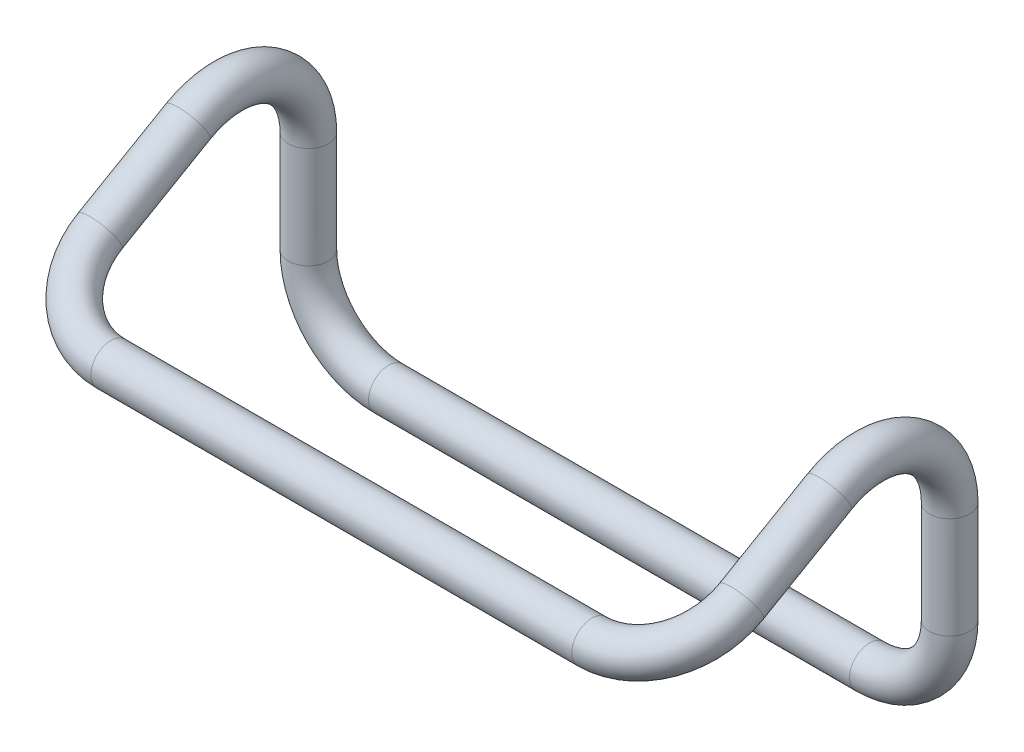
ISO-10303-21;
HEADER;
FILE_DESCRIPTION(('STEP AP214'),'2;1');
FILE_NAME('part.step','',(''),(''),'','','');
FILE_SCHEMA(('AUTOMOTIVE_DESIGN { 1 0 10303 214 1 1 1 1 }'));
ENDSEC;
DATA;
#1=APPLICATION_CONTEXT('core data for automotive mechanical design processes');
#2=APPLICATION_PROTOCOL_DEFINITION('international standard','automotive_design',2000,#1);
#3=PRODUCT_CONTEXT('',#1,'mechanical');
#4=PRODUCT('Part','Part','',(#3));
#5=PRODUCT_RELATED_PRODUCT_CATEGORY('part','',(#4));
#6=PRODUCT_DEFINITION_FORMATION('','',#4);
#7=PRODUCT_DEFINITION_CONTEXT('part definition',#1,'design');
#8=PRODUCT_DEFINITION('design','',#6,#7);
#9=PRODUCT_DEFINITION_SHAPE('','',#8);
#10=(LENGTH_UNIT() NAMED_UNIT(*) SI_UNIT(.MILLI.,.METRE.));
#11=(NAMED_UNIT(*) PLANE_ANGLE_UNIT() SI_UNIT($,.RADIAN.));
#12=(NAMED_UNIT(*) SI_UNIT($,.STERADIAN.) SOLID_ANGLE_UNIT());
#13=UNCERTAINTY_MEASURE_WITH_UNIT(LENGTH_MEASURE(1.E-05),#10,'distance_accuracy_value','');
#14=(GEOMETRIC_REPRESENTATION_CONTEXT(3) GLOBAL_UNCERTAINTY_ASSIGNED_CONTEXT((#13)) GLOBAL_UNIT_ASSIGNED_CONTEXT((#10,
#11,#12)) REPRESENTATION_CONTEXT('',''));
#15=CARTESIAN_POINT('',(0.,0.,0.));
#16=DIRECTION('',(0.,0.,1.));
#17=DIRECTION('',(1.,0.,0.));
#18=AXIS2_PLACEMENT_3D('',#15,#16,#17);
#19=CARTESIAN_POINT('',(0.,-19.9999999999996,-69.2820323027549));
#20=DIRECTION('',(0.,1.,0.));
#21=DIRECTION('',(-1.,0.,0.));
#22=AXIS2_PLACEMENT_3D('',#19,#20,#21);
#23=CYLINDRICAL_SURFACE('',#22,5.);
#24=CARTESIAN_POINT('',(0.,5.35898384862261,-69.2820323027549));
#25=DIRECTION('',(0.,1.,0.));
#26=DIRECTION('',(0.,0.,1.));
#27=AXIS2_PLACEMENT_3D('',#24,#25,#26);
#28=CIRCLE('',#27,5.);
#29=CARTESIAN_POINT('',(0.,5.35898384862262,-74.2820323027549));
#30=VERTEX_POINT('',#29);
#31=EDGE_CURVE('E100',#30,#30,#28,.T.);
#32=ORIENTED_EDGE('',*,*,#31,.F.);
#33=EDGE_LOOP('',(#32));
#34=FACE_BOUND('',#33,.T.);
#35=CARTESIAN_POINT('',(0.,-19.9999999999996,-69.2820323027549));
#36=DIRECTION('',(0.,1.,0.));
#37=DIRECTION('',(0.,0.,1.));
#38=AXIS2_PLACEMENT_3D('',#35,#36,#37);
#39=CIRCLE('',#38,5.);
#40=CARTESIAN_POINT('',(-5.00000000000005,-19.9999999999996,-69.2820323027549));
#41=VERTEX_POINT('',#40);
#42=EDGE_CURVE('E11',#41,#41,#39,.T.);
#43=ORIENTED_EDGE('',*,*,#42,.T.);
#44=EDGE_LOOP('',(#43));
#45=FACE_BOUND('',#44,.T.);
#46=ADVANCED_FACE('F49',(#34,#45),#23,.T.);
#47=CARTESIAN_POINT('',(20.,-19.9999999999997,-69.2820323027549));
#48=DIRECTION('',(0.,0.,-1.));
#49=DIRECTION('',(-1.,0.,0.));
#50=AXIS2_PLACEMENT_3D('',#47,#48,#49);
#51=TOROIDAL_SURFACE('',#50,20.,5.);
#52=CARTESIAN_POINT('',(20.,-39.9999999999997,-69.2820323027549));
#53=DIRECTION('',(-1.,0.,0.));
#54=DIRECTION('',(0.,0.,1.));
#55=AXIS2_PLACEMENT_3D('',#52,#53,#54);
#56=CIRCLE('',#55,5.);
#57=CARTESIAN_POINT('',(20.,-44.9999999999997,-69.2820323027549));
#58=VERTEX_POINT('',#57);
#59=EDGE_CURVE('E56',#58,#58,#56,.T.);
#60=CARTESIAN_POINT('',(20.,-19.9999999999997,-69.2820323027549));
#61=DIRECTION('',(0.,0.,-1.));
#62=DIRECTION('',(-1.,0.,0.));
#63=AXIS2_PLACEMENT_3D('',#60,#61,#62);
#64=CIRCLE('',#63,25.);
#65=EDGE_CURVE('',#58,#41,#64,.T.);
#66=ORIENTED_EDGE('',*,*,#59,.T.);
#67=ORIENTED_EDGE('',*,*,#42,.F.);
#68=ORIENTED_EDGE('',*,*,#65,.T.);
#69=ORIENTED_EDGE('',*,*,#65,.F.);
#70=EDGE_LOOP('',(#66,#68,#67,#69));
#71=FACE_BOUND('',#70,.T.);
#72=ADVANCED_FACE('F108',(#71),#51,.T.);
#73=CARTESIAN_POINT('',(140.,-39.9999999999997,-69.2820323027549));
#74=DIRECTION('',(-1.,0.,0.));
#75=DIRECTION('',(0.,-1.,0.));
#76=AXIS2_PLACEMENT_3D('',#73,#74,#75);
#77=CYLINDRICAL_SURFACE('',#76,5.);
#78=ORIENTED_EDGE('',*,*,#59,.F.);
#79=EDGE_LOOP('',(#78));
#80=FACE_BOUND('',#79,.T.);
#81=CARTESIAN_POINT('',(140.,-39.9999999999997,-69.2820323027549));
#82=DIRECTION('',(-1.,0.,0.));
#83=DIRECTION('',(0.,0.,1.));
#84=AXIS2_PLACEMENT_3D('',#81,#82,#83);
#85=CIRCLE('',#84,5.);
#86=CARTESIAN_POINT('',(140.,-44.9999999999997,-69.2820323027549));
#87=VERTEX_POINT('',#86);
#88=EDGE_CURVE('E61',#87,#87,#85,.T.);
#89=ORIENTED_EDGE('',*,*,#88,.T.);
#90=EDGE_LOOP('',(#89));
#91=FACE_BOUND('',#90,.T.);
#92=ADVANCED_FACE('F112',(#80,#91),#77,.T.);
#93=CARTESIAN_POINT('',(140.,-19.9999999999997,-69.2820323027549));
#94=DIRECTION('',(0.,0.,-1.));
#95=DIRECTION('',(0.,1.,0.));
#96=AXIS2_PLACEMENT_3D('',#93,#94,#95);
#97=TOROIDAL_SURFACE('',#96,20.,5.);
#98=CARTESIAN_POINT('',(160.,-19.9999999999997,-69.2820323027549));
#99=DIRECTION('',(0.,-1.,0.));
#100=DIRECTION('',(0.,0.,1.));
#101=AXIS2_PLACEMENT_3D('',#98,#99,#100);
#102=CIRCLE('',#101,5.);
#103=CARTESIAN_POINT('',(165.,-19.9999999999997,-69.2820323027549));
#104=VERTEX_POINT('',#103);
#105=EDGE_CURVE('E66',#104,#104,#102,.T.);
#106=CARTESIAN_POINT('',(140.,-19.9999999999997,-69.2820323027549));
#107=DIRECTION('',(0.,0.,-1.));
#108=DIRECTION('',(0.,1.,0.));
#109=AXIS2_PLACEMENT_3D('',#106,#107,#108);
#110=CIRCLE('',#109,25.);
#111=EDGE_CURVE('',#104,#87,#110,.T.);
#112=ORIENTED_EDGE('',*,*,#105,.T.);
#113=ORIENTED_EDGE('',*,*,#88,.F.);
#114=ORIENTED_EDGE('',*,*,#111,.T.);
#115=ORIENTED_EDGE('',*,*,#111,.F.);
#116=EDGE_LOOP('',(#112,#114,#113,#115));
#117=FACE_BOUND('',#116,.T.);
#118=ADVANCED_FACE('F117',(#117),#97,.T.);
#119=CARTESIAN_POINT('',(160.,5.35898384862259,-69.2820323027549));
#120=DIRECTION('',(0.,-1.,0.));
#121=DIRECTION('',(0.,0.,-1.));
#122=AXIS2_PLACEMENT_3D('',#119,#120,#121);
#123=CYLINDRICAL_SURFACE('',#122,5.);
#124=ORIENTED_EDGE('',*,*,#105,.F.);
#125=EDGE_LOOP('',(#124));
#126=FACE_BOUND('',#125,.T.);
#127=CARTESIAN_POINT('',(160.,5.3589838486226,-69.2820323027549));
#128=DIRECTION('',(0.,-1.,0.));
#129=DIRECTION('',(0.,0.,1.));
#130=AXIS2_PLACEMENT_3D('',#127,#128,#129);
#131=CIRCLE('',#130,5.);
#132=CARTESIAN_POINT('',(160.,5.3589838486226,-74.2820323027549));
#133=VERTEX_POINT('',#132);
#134=EDGE_CURVE('E72',#133,#133,#131,.T.);
#135=ORIENTED_EDGE('',*,*,#134,.T.);
#136=EDGE_LOOP('',(#135));
#137=FACE_BOUND('',#136,.T.);
#138=ADVANCED_FACE('F123',(#126,#137),#123,.T.);
#139=CARTESIAN_POINT('',(160.,5.35898384862259,-49.2820323027549));
#140=DIRECTION('',(-1.,0.,0.));
#141=DIRECTION('',(0.,0.,1.));
#142=AXIS2_PLACEMENT_3D('',#139,#140,#141);
#143=TOROIDAL_SURFACE('',#142,20.,5.);
#144=CARTESIAN_POINT('',(160.,22.6794919243113,-39.2820323027548));
#145=DIRECTION('',(0.,0.500000000000004,-0.866025403784437));
#146=DIRECTION('',(0.,-0.866025403784437,-0.500000000000004));
#147=AXIS2_PLACEMENT_3D('',#144,#145,#146);
#148=CIRCLE('',#147,5.);
#149=CARTESIAN_POINT('',(160.,27.0096189432335,-36.7820323027548));
#150=VERTEX_POINT('',#149);
#151=EDGE_CURVE('E76',#150,#150,#148,.T.);
#152=CARTESIAN_POINT('',(160.,5.35898384862259,-49.2820323027549));
#153=DIRECTION('',(-1.,0.,0.));
#154=DIRECTION('',(0.,0.,1.));
#155=AXIS2_PLACEMENT_3D('',#152,#153,#154);
#156=CIRCLE('',#155,25.);
#157=EDGE_CURVE('',#150,#133,#156,.T.);
#158=ORIENTED_EDGE('',*,*,#151,.T.);
#159=ORIENTED_EDGE('',*,*,#134,.F.);
#160=ORIENTED_EDGE('',*,*,#157,.T.);
#161=ORIENTED_EDGE('',*,*,#157,.F.);
#162=EDGE_LOOP('',(#158,#160,#159,#161));
#163=FACE_BOUND('',#162,.T.);
#164=ADVANCED_FACE('F127',(#163),#143,.T.);
#165=CARTESIAN_POINT('',(160.,10.0000000000001,-17.3205080756887));
#166=DIRECTION('',(0.,0.500000000000004,-0.866025403784436));
#167=DIRECTION('',(0.,0.866025403784436,0.500000000000004));
#168=AXIS2_PLACEMENT_3D('',#165,#166,#167);
#169=CYLINDRICAL_SURFACE('',#168,5.);
#170=ORIENTED_EDGE('',*,*,#151,.F.);
#171=EDGE_LOOP('',(#170));
#172=FACE_BOUND('',#171,.T.);
#173=CARTESIAN_POINT('',(160.,10.0000000000001,-17.3205080756887));
#174=DIRECTION('',(0.,0.500000000000004,-0.866025403784437));
#175=DIRECTION('',(0.,-0.866025403784437,-0.500000000000004));
#176=AXIS2_PLACEMENT_3D('',#173,#174,#175);
#177=CIRCLE('',#176,5.);
#178=CARTESIAN_POINT('',(165.,10.0000000000001,-17.3205080756888));
#179=VERTEX_POINT('',#178);
#180=EDGE_CURVE('E80',#179,#179,#177,.T.);
#181=ORIENTED_EDGE('',*,*,#180,.T.);
#182=EDGE_LOOP('',(#181));
#183=FACE_BOUND('',#182,.T.);
#184=ADVANCED_FACE('F131',(#172,#183),#169,.T.);
#185=CARTESIAN_POINT('',(140.,10.0000000000001,-17.3205080756887));
#186=DIRECTION('',(0.,0.866025403784436,0.500000000000004));
#187=DIRECTION('',(0.,-0.500000000000004,0.866025403784436));
#188=AXIS2_PLACEMENT_3D('',#185,#186,#187);
#189=TOROIDAL_SURFACE('',#188,20.,5.);
#190=CARTESIAN_POINT('',(140.,0.,0.));
#191=DIRECTION('',(1.,0.,0.));
#192=DIRECTION('',(0.,-0.866025403784437,-0.500000000000004));
#193=AXIS2_PLACEMENT_3D('',#190,#191,#192);
#194=CIRCLE('',#193,5.);
#195=CARTESIAN_POINT('',(140.,-2.50000000000002,4.33012701892218));
#196=VERTEX_POINT('',#195);
#197=EDGE_CURVE('E84',#196,#196,#194,.T.);
#198=CARTESIAN_POINT('',(140.,10.0000000000001,-17.3205080756887));
#199=DIRECTION('',(0.,0.866025403784436,0.500000000000004));
#200=DIRECTION('',(0.,-0.500000000000004,0.866025403784436));
#201=AXIS2_PLACEMENT_3D('',#198,#199,#200);
#202=CIRCLE('',#201,25.);
#203=EDGE_CURVE('',#196,#179,#202,.T.);
#204=ORIENTED_EDGE('',*,*,#197,.T.);
#205=ORIENTED_EDGE('',*,*,#180,.F.);
#206=ORIENTED_EDGE('',*,*,#203,.T.);
#207=ORIENTED_EDGE('',*,*,#203,.F.);
#208=EDGE_LOOP('',(#204,#206,#205,#207));
#209=FACE_BOUND('',#208,.T.);
#210=ADVANCED_FACE('F135',(#209),#189,.T.);
#211=CARTESIAN_POINT('',(20.,0.,0.));
#212=DIRECTION('',(1.,0.,0.));
#213=DIRECTION('',(0.,1.,0.));
#214=AXIS2_PLACEMENT_3D('',#211,#212,#213);
#215=CYLINDRICAL_SURFACE('',#214,5.);
#216=ORIENTED_EDGE('',*,*,#197,.F.);
#217=EDGE_LOOP('',(#216));
#218=FACE_BOUND('',#217,.T.);
#219=CARTESIAN_POINT('',(20.,0.,0.));
#220=DIRECTION('',(1.,0.,0.));
#221=DIRECTION('',(0.,-0.866025403784437,-0.500000000000004));
#222=AXIS2_PLACEMENT_3D('',#219,#220,#221);
#223=CIRCLE('',#222,5.);
#224=CARTESIAN_POINT('',(20.,-2.50000000000002,4.33012701892219));
#225=VERTEX_POINT('',#224);
#226=EDGE_CURVE('E88',#225,#225,#223,.T.);
#227=ORIENTED_EDGE('',*,*,#226,.T.);
#228=EDGE_LOOP('',(#227));
#229=FACE_BOUND('',#228,.T.);
#230=ADVANCED_FACE('F139',(#218,#229),#215,.T.);
#231=CARTESIAN_POINT('',(20.,10.0000000000001,-17.3205080756887));
#232=DIRECTION('',(0.,0.866025403784436,0.500000000000004));
#233=DIRECTION('',(0.,-0.500000000000004,0.866025403784436));
#234=AXIS2_PLACEMENT_3D('',#231,#232,#233);
#235=TOROIDAL_SURFACE('',#234,20.,5.);
#236=CARTESIAN_POINT('',(0.,10.0000000000001,-17.3205080756887));
#237=DIRECTION('',(0.,-0.500000000000004,0.866025403784436));
#238=DIRECTION('',(0.,-0.866025403784436,-0.500000000000004));
#239=AXIS2_PLACEMENT_3D('',#236,#237,#238);
#240=CIRCLE('',#239,5.);
#241=CARTESIAN_POINT('',(-5.00000000000001,10.0000000000001,-17.3205080756887));
#242=VERTEX_POINT('',#241);
#243=EDGE_CURVE('E92',#242,#242,#240,.T.);
#244=CARTESIAN_POINT('',(20.,10.0000000000001,-17.3205080756887));
#245=DIRECTION('',(0.,0.866025403784436,0.500000000000004));
#246=DIRECTION('',(0.,-0.500000000000004,0.866025403784436));
#247=AXIS2_PLACEMENT_3D('',#244,#245,#246);
#248=CIRCLE('',#247,25.);
#249=EDGE_CURVE('',#242,#225,#248,.T.);
#250=ORIENTED_EDGE('',*,*,#243,.T.);
#251=ORIENTED_EDGE('',*,*,#226,.F.);
#252=ORIENTED_EDGE('',*,*,#249,.T.);
#253=ORIENTED_EDGE('',*,*,#249,.F.);
#254=EDGE_LOOP('',(#250,#252,#251,#253));
#255=FACE_BOUND('',#254,.T.);
#256=ADVANCED_FACE('F143',(#255),#235,.T.);
#257=CARTESIAN_POINT('',(0.,22.6794919243113,-39.2820323027548));
#258=DIRECTION('',(0.,-0.500000000000004,0.866025403784436));
#259=DIRECTION('',(0.,-0.866025403784436,-0.500000000000004));
#260=AXIS2_PLACEMENT_3D('',#257,#258,#259);
#261=CYLINDRICAL_SURFACE('',#260,5.);
#262=ORIENTED_EDGE('',*,*,#243,.F.);
#263=EDGE_LOOP('',(#262));
#264=FACE_BOUND('',#263,.T.);
#265=CARTESIAN_POINT('',(0.,22.6794919243113,-39.2820323027548));
#266=DIRECTION('',(0.,-0.500000000000005,0.866025403784436));
#267=DIRECTION('',(0.,-0.866025403784436,-0.500000000000005));
#268=AXIS2_PLACEMENT_3D('',#265,#266,#267);
#269=CIRCLE('',#268,5.);
#270=CARTESIAN_POINT('',(0.,27.0096189432335,-36.7820323027548));
#271=VERTEX_POINT('',#270);
#272=EDGE_CURVE('E96',#271,#271,#269,.T.);
#273=ORIENTED_EDGE('',*,*,#272,.T.);
#274=EDGE_LOOP('',(#273));
#275=FACE_BOUND('',#274,.T.);
#276=ADVANCED_FACE('F147',(#264,#275),#261,.T.);
#277=CARTESIAN_POINT('',(0.,5.35898384862259,-49.2820323027549));
#278=DIRECTION('',(1.,0.,0.));
#279=DIRECTION('',(0.,0.,-1.));
#280=AXIS2_PLACEMENT_3D('',#277,#278,#279);
#281=TOROIDAL_SURFACE('',#280,20.,5.);
#282=CARTESIAN_POINT('',(0.,5.35898384862259,-49.2820323027549));
#283=DIRECTION('',(1.,0.,0.));
#284=DIRECTION('',(0.,0.,-1.));
#285=AXIS2_PLACEMENT_3D('',#282,#283,#284);
#286=CIRCLE('',#285,25.);
#287=EDGE_CURVE('',#30,#271,#286,.T.);
#288=ORIENTED_EDGE('',*,*,#31,.T.);
#289=ORIENTED_EDGE('',*,*,#272,.F.);
#290=ORIENTED_EDGE('',*,*,#287,.T.);
#291=ORIENTED_EDGE('',*,*,#287,.F.);
#292=EDGE_LOOP('',(#288,#290,#289,#291));
#293=FACE_BOUND('',#292,.T.);
#294=ADVANCED_FACE('F105',(#293),#281,.T.);
#295=CLOSED_SHELL('',(#46,#72,#92,#118,#138,#164,#184,#210,#230,#256,#276,#294));
#296=MANIFOLD_SOLID_BREP('B2',#295);
#297=ADVANCED_BREP_SHAPE_REPRESENTATION('',(#18,#296),#14);
#298=SHAPE_DEFINITION_REPRESENTATION(#9,#297);
ENDSEC;
END-ISO-10303-21;
